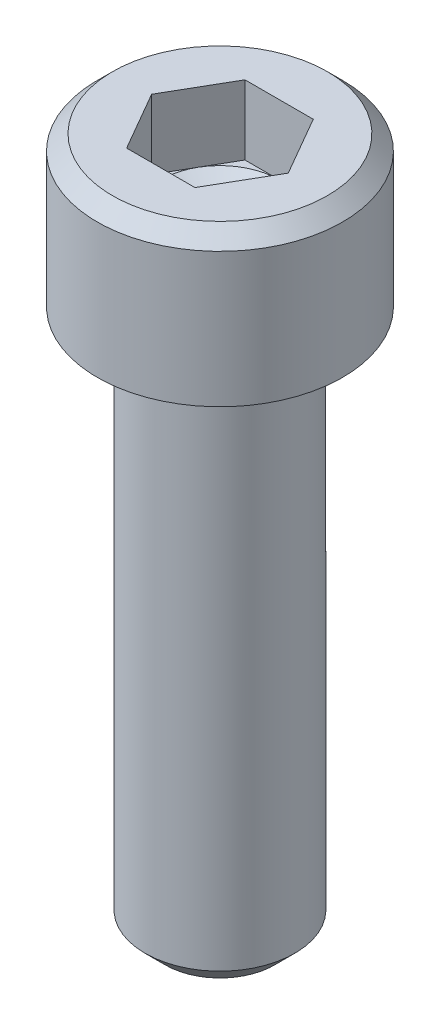
ISO-10303-21;
HEADER;
FILE_DESCRIPTION(('STEP AP214'),'2;1');
FILE_NAME('part.step','',(''),(''),'','','');
FILE_SCHEMA(('AUTOMOTIVE_DESIGN { 1 0 10303 214 1 1 1 1 }'));
ENDSEC;
DATA;
#1=APPLICATION_CONTEXT('core data for automotive mechanical design processes');
#2=APPLICATION_PROTOCOL_DEFINITION('international standard','automotive_design',2000,#1);
#3=PRODUCT_CONTEXT('',#1,'mechanical');
#4=PRODUCT('Part','Part','',(#3));
#5=PRODUCT_RELATED_PRODUCT_CATEGORY('part','',(#4));
#6=PRODUCT_DEFINITION_FORMATION('','',#4);
#7=PRODUCT_DEFINITION_CONTEXT('part definition',#1,'design');
#8=PRODUCT_DEFINITION('design','',#6,#7);
#9=PRODUCT_DEFINITION_SHAPE('','',#8);
#10=(LENGTH_UNIT() NAMED_UNIT(*) SI_UNIT(.MILLI.,.METRE.));
#11=(NAMED_UNIT(*) PLANE_ANGLE_UNIT() SI_UNIT($,.RADIAN.));
#12=(NAMED_UNIT(*) SI_UNIT($,.STERADIAN.) SOLID_ANGLE_UNIT());
#13=UNCERTAINTY_MEASURE_WITH_UNIT(LENGTH_MEASURE(1.E-05),#10,'distance_accuracy_value','');
#14=(GEOMETRIC_REPRESENTATION_CONTEXT(3) GLOBAL_UNCERTAINTY_ASSIGNED_CONTEXT((#13)) GLOBAL_UNIT_ASSIGNED_CONTEXT((#10,
#11,#12)) REPRESENTATION_CONTEXT('',''));
#15=CARTESIAN_POINT('',(0.,0.,0.));
#16=DIRECTION('',(0.,0.,1.));
#17=DIRECTION('',(1.,0.,0.));
#18=AXIS2_PLACEMENT_3D('',#15,#16,#17);
#19=CARTESIAN_POINT('',(0.,1.8796,0.));
#20=DIRECTION('',(0.,1.,0.));
#21=DIRECTION('',(0.,0.,1.));
#22=AXIS2_PLACEMENT_3D('',#19,#20,#21);
#23=PLANE('',#22);
#24=DIRECTION('',(0.5,0.,-0.866025403784439));
#25=VECTOR('',#24,1.);
#26=CARTESIAN_POINT('',(0.799225977639064,1.8796,1.38429999999992));
#27=LINE('',#26,#25);
#28=CARTESIAN_POINT('',(0.799225977639064,1.8796,1.38429999999992));
#29=VERTEX_POINT('',#28);
#30=CARTESIAN_POINT('',(1.19883896645866,1.87960000005181,0.692149999999922));
#31=VERTEX_POINT('',#30);
#32=EDGE_CURVE('E159',#29,#31,#27,.T.);
#33=ORIENTED_EDGE('',*,*,#32,.T.);
#34=CARTESIAN_POINT('',(0.,1.87960000005181,0.));
#35=DIRECTION('',(0.,-1.,0.));
#36=DIRECTION('',(1.,0.,0.));
#37=AXIS2_PLACEMENT_3D('',#34,#35,#36);
#38=CIRCLE('',#37,1.38429999998393);
#39=CARTESIAN_POINT('',(0.,1.87960000005181,1.38429999998393));
#40=VERTEX_POINT('',#39);
#41=EDGE_CURVE('E47',#31,#40,#38,.T.);
#42=ORIENTED_EDGE('',*,*,#41,.T.);
#43=DIRECTION('',(1.,0.,0.));
#44=VECTOR('',#43,1.);
#45=CARTESIAN_POINT('',(-0.799225977639255,1.8796,1.38429999999992));
#46=LINE('',#45,#44);
#47=EDGE_CURVE('E189',#40,#29,#46,.T.);
#48=ORIENTED_EDGE('',*,*,#47,.T.);
#49=EDGE_LOOP('',(#33,#42,#48));
#50=FACE_BOUND('',#49,.T.);
#51=ADVANCED_FACE('F32',(#50),#23,.T.);
#52=CARTESIAN_POINT('',(-0.799225977639255,1.8796,1.38429999999992));
#53=VERTEX_POINT('',#52);
#54=EDGE_CURVE('E279',#53,#40,#46,.T.);
#55=ORIENTED_EDGE('',*,*,#54,.T.);
#56=CARTESIAN_POINT('',(-1.19883896644491,1.87960000005181,0.692149999991913));
#57=VERTEX_POINT('',#56);
#58=EDGE_CURVE('E208',#40,#57,#38,.T.);
#59=ORIENTED_EDGE('',*,*,#58,.T.);
#60=DIRECTION('',(0.499999999999962,0.,0.866025403784461));
#61=VECTOR('',#60,1.);
#62=CARTESIAN_POINT('',(-1.59845195527835,1.8796,0.));
#63=LINE('',#62,#61);
#64=EDGE_CURVE('E168',#57,#53,#63,.T.);
#65=ORIENTED_EDGE('',*,*,#64,.T.);
#66=EDGE_LOOP('',(#55,#59,#65));
#67=FACE_BOUND('',#66,.T.);
#68=ADVANCED_FACE('F122',(#67),#23,.T.);
#69=CARTESIAN_POINT('',(-1.59845195527835,1.8796,0.));
#70=VERTEX_POINT('',#69);
#71=EDGE_CURVE('E169',#70,#57,#63,.T.);
#72=ORIENTED_EDGE('',*,*,#71,.T.);
#73=CARTESIAN_POINT('',(-1.19883896644488,1.87960000005181,-0.692149999991966));
#74=VERTEX_POINT('',#73);
#75=EDGE_CURVE('E282',#57,#74,#38,.T.);
#76=ORIENTED_EDGE('',*,*,#75,.T.);
#77=DIRECTION('',(-0.5,0.,0.866025403784439));
#78=VECTOR('',#77,1.);
#79=CARTESIAN_POINT('',(-0.799225977639255,1.8796,-1.38429999999987));
#80=LINE('',#79,#78);
#81=EDGE_CURVE('E164',#74,#70,#80,.T.);
#82=ORIENTED_EDGE('',*,*,#81,.T.);
#83=EDGE_LOOP('',(#72,#76,#82));
#84=FACE_BOUND('',#83,.T.);
#85=ADVANCED_FACE('F128',(#84),#23,.T.);
#86=CARTESIAN_POINT('',(-0.799225977639255,1.8796,-1.38429999999987));
#87=VERTEX_POINT('',#86);
#88=EDGE_CURVE('E165',#87,#74,#80,.T.);
#89=ORIENTED_EDGE('',*,*,#88,.T.);
#90=CARTESIAN_POINT('',(0.,1.87960000005181,-1.38429999998393));
#91=VERTEX_POINT('',#90);
#92=EDGE_CURVE('E285',#74,#91,#38,.T.);
#93=ORIENTED_EDGE('',*,*,#92,.T.);
#94=DIRECTION('',(-1.,0.,0.));
#95=VECTOR('',#94,1.);
#96=CARTESIAN_POINT('',(0.799225977638982,1.8796,-1.38429999999987));
#97=LINE('',#96,#95);
#98=EDGE_CURVE('E154',#91,#87,#97,.T.);
#99=ORIENTED_EDGE('',*,*,#98,.T.);
#100=EDGE_LOOP('',(#89,#93,#99));
#101=FACE_BOUND('',#100,.T.);
#102=ADVANCED_FACE('F143',(#101),#23,.T.);
#103=CARTESIAN_POINT('',(0.799225977638982,1.8796,-1.38429999999987));
#104=VERTEX_POINT('',#103);
#105=EDGE_CURVE('E157',#104,#91,#97,.T.);
#106=ORIENTED_EDGE('',*,*,#105,.T.);
#107=CARTESIAN_POINT('',(1.19883896644488,1.87960000005181,-0.692149999991966));
#108=VERTEX_POINT('',#107);
#109=EDGE_CURVE('E283',#91,#108,#38,.T.);
#110=ORIENTED_EDGE('',*,*,#109,.T.);
#111=DIRECTION('',(-0.5,0.,-0.866025403784439));
#112=VECTOR('',#111,1.);
#113=CARTESIAN_POINT('',(1.59845195527816,1.8796,0.));
#114=LINE('',#113,#112);
#115=EDGE_CURVE('E155',#108,#104,#114,.T.);
#116=ORIENTED_EDGE('',*,*,#115,.T.);
#117=EDGE_LOOP('',(#106,#110,#116));
#118=FACE_BOUND('',#117,.T.);
#119=ADVANCED_FACE('F134',(#118),#23,.T.);
#120=CARTESIAN_POINT('',(1.59845195527816,1.8796,0.));
#121=VERTEX_POINT('',#120);
#122=EDGE_CURVE('E147',#121,#108,#114,.T.);
#123=ORIENTED_EDGE('',*,*,#122,.T.);
#124=EDGE_CURVE('E148',#108,#31,#38,.T.);
#125=ORIENTED_EDGE('',*,*,#124,.T.);
#126=EDGE_CURVE('E150',#31,#121,#27,.T.);
#127=ORIENTED_EDGE('',*,*,#126,.T.);
#128=EDGE_LOOP('',(#123,#125,#127));
#129=FACE_BOUND('',#128,.T.);
#130=ADVANCED_FACE('F124',(#129),#23,.T.);
#131=CARTESIAN_POINT('',(0.,0.,0.));
#132=DIRECTION('',(0.,-1.,0.));
#133=DIRECTION('',(0.,0.,-1.));
#134=AXIS2_PLACEMENT_3D('',#131,#132,#133);
#135=PLANE('',#134);
#136=CARTESIAN_POINT('',(0.,0.,0.));
#137=DIRECTION('',(0.,-1.,0.));
#138=DIRECTION('',(0.,0.,-1.));
#139=AXIS2_PLACEMENT_3D('',#136,#137,#138);
#140=CIRCLE('',#139,2.0066);
#141=CARTESIAN_POINT('',(0.,0.,-2.0066));
#142=VERTEX_POINT('',#141);
#143=EDGE_CURVE('E11',#142,#142,#140,.F.);
#144=ORIENTED_EDGE('',*,*,#143,.T.);
#145=EDGE_LOOP('',(#144));
#146=FACE_BOUND('',#145,.T.);
#147=CARTESIAN_POINT('',(0.,0.,0.));
#148=DIRECTION('',(0.,-1.,0.));
#149=DIRECTION('',(0.,0.,-1.));
#150=AXIS2_PLACEMENT_3D('',#147,#148,#149);
#151=CIRCLE('',#150,2.8702);
#152=CARTESIAN_POINT('',(0.,0.,-2.8702));
#153=VERTEX_POINT('',#152);
#154=EDGE_CURVE('E192',#153,#153,#151,.T.);
#155=ORIENTED_EDGE('',*,*,#154,.T.);
#156=EDGE_LOOP('',(#155));
#157=FACE_BOUND('',#156,.T.);
#158=ADVANCED_FACE('F133',(#146,#157),#135,.T.);
#159=CARTESIAN_POINT('',(0.,3.5052,0.));
#160=DIRECTION('',(0.,-1.,0.));
#161=DIRECTION('',(0.,0.,-1.));
#162=AXIS2_PLACEMENT_3D('',#159,#160,#161);
#163=CYLINDRICAL_SURFACE('',#162,2.8702);
#164=CARTESIAN_POINT('',(0.,3.14959999996017,0.));
#165=DIRECTION('',(0.,1.,0.));
#166=DIRECTION('',(0.,0.,1.));
#167=AXIS2_PLACEMENT_3D('',#164,#165,#166);
#168=CIRCLE('',#167,2.8702);
#169=CARTESIAN_POINT('',(0.,3.14959999996017,-2.8702));
#170=VERTEX_POINT('',#169);
#171=EDGE_CURVE('E211',#170,#170,#168,.F.);
#172=ORIENTED_EDGE('',*,*,#171,.T.);
#173=EDGE_LOOP('',(#172));
#174=FACE_BOUND('',#173,.T.);
#175=ORIENTED_EDGE('',*,*,#154,.F.);
#176=EDGE_LOOP('',(#175));
#177=FACE_BOUND('',#176,.T.);
#178=ADVANCED_FACE('F140',(#174,#177),#163,.T.);
#179=CARTESIAN_POINT('',(2.8702,3.5052,0.));
#180=DIRECTION('',(0.,1.,0.));
#181=DIRECTION('',(0.,0.,1.));
#182=AXIS2_PLACEMENT_3D('',#179,#180,#181);
#183=PLANE('',#182);
#184=CARTESIAN_POINT('',(0.,3.5052,0.));
#185=DIRECTION('',(0.,1.,0.));
#186=DIRECTION('',(0.,0.,1.));
#187=AXIS2_PLACEMENT_3D('',#184,#185,#186);
#188=CIRCLE('',#187,2.51459999996016);
#189=CARTESIAN_POINT('',(0.,3.5052,-2.51459999996016));
#190=VERTEX_POINT('',#189);
#191=EDGE_CURVE('E214',#190,#190,#188,.T.);
#192=ORIENTED_EDGE('',*,*,#191,.T.);
#193=EDGE_LOOP('',(#192));
#194=FACE_BOUND('',#193,.T.);
#195=DIRECTION('',(1.,0.,0.));
#196=VECTOR('',#195,1.);
#197=CARTESIAN_POINT('',(-0.799225977639255,3.5052,1.38429999999992));
#198=LINE('',#197,#196);
#199=CARTESIAN_POINT('',(-0.799225977639255,3.5052,1.38429999999992));
#200=VERTEX_POINT('',#199);
#201=CARTESIAN_POINT('',(0.799225977639064,3.5052,1.38429999999992));
#202=VERTEX_POINT('',#201);
#203=EDGE_CURVE('E55',#200,#202,#198,.T.);
#204=ORIENTED_EDGE('',*,*,#203,.F.);
#205=DIRECTION('',(0.499999999999962,0.,0.866025403784461));
#206=VECTOR('',#205,1.);
#207=CARTESIAN_POINT('',(-1.59845195527835,3.5052,0.));
#208=LINE('',#207,#206);
#209=CARTESIAN_POINT('',(-1.59845195527835,3.5052,0.));
#210=VERTEX_POINT('',#209);
#211=EDGE_CURVE('E186',#210,#200,#208,.T.);
#212=ORIENTED_EDGE('',*,*,#211,.F.);
#213=DIRECTION('',(-0.5,0.,0.866025403784439));
#214=VECTOR('',#213,1.);
#215=CARTESIAN_POINT('',(-0.799225977639255,3.5052,-1.38429999999987));
#216=LINE('',#215,#214);
#217=CARTESIAN_POINT('',(-0.799225977639255,3.5052,-1.38429999999987));
#218=VERTEX_POINT('',#217);
#219=EDGE_CURVE('E183',#218,#210,#216,.T.);
#220=ORIENTED_EDGE('',*,*,#219,.F.);
#221=DIRECTION('',(-1.,0.,0.));
#222=VECTOR('',#221,1.);
#223=CARTESIAN_POINT('',(0.799225977638982,3.5052,-1.38429999999987));
#224=LINE('',#223,#222);
#225=CARTESIAN_POINT('',(0.799225977638982,3.5052,-1.38429999999987));
#226=VERTEX_POINT('',#225);
#227=EDGE_CURVE('E180',#226,#218,#224,.T.);
#228=ORIENTED_EDGE('',*,*,#227,.F.);
#229=DIRECTION('',(-0.5,0.,-0.866025403784439));
#230=VECTOR('',#229,1.);
#231=CARTESIAN_POINT('',(1.59845195527816,3.5052,0.));
#232=LINE('',#231,#230);
#233=CARTESIAN_POINT('',(1.59845195527816,3.5052,0.));
#234=VERTEX_POINT('',#233);
#235=EDGE_CURVE('E177',#234,#226,#232,.T.);
#236=ORIENTED_EDGE('',*,*,#235,.F.);
#237=DIRECTION('',(0.5,0.,-0.866025403784439));
#238=VECTOR('',#237,1.);
#239=CARTESIAN_POINT('',(0.799225977639064,3.5052,1.38429999999992));
#240=LINE('',#239,#238);
#241=EDGE_CURVE('E174',#202,#234,#240,.T.);
#242=ORIENTED_EDGE('',*,*,#241,.F.);
#243=EDGE_LOOP('',(#204,#212,#220,#228,#236,#242));
#244=FACE_BOUND('',#243,.T.);
#245=ADVANCED_FACE('F233',(#194,#244),#183,.T.);
#246=CARTESIAN_POINT('',(0.,-12.7,0.));
#247=DIRECTION('',(0.,1.,0.));
#248=DIRECTION('',(0.,0.,1.));
#249=AXIS2_PLACEMENT_3D('',#246,#247,#248);
#250=CYLINDRICAL_SURFACE('',#249,1.7526);
#251=CARTESIAN_POINT('',(0.,-0.254000000000001,0.));
#252=DIRECTION('',(0.,-1.,0.));
#253=DIRECTION('',(0.,0.,-1.));
#254=AXIS2_PLACEMENT_3D('',#251,#252,#253);
#255=CIRCLE('',#254,1.7526);
#256=CARTESIAN_POINT('',(0.,-0.254000000000001,-1.7526));
#257=VERTEX_POINT('',#256);
#258=EDGE_CURVE('E40',#257,#257,#255,.T.);
#259=ORIENTED_EDGE('',*,*,#258,.T.);
#260=EDGE_LOOP('',(#259));
#261=FACE_BOUND('',#260,.T.);
#262=CARTESIAN_POINT('',(0.,-12.2275599999848,0.));
#263=DIRECTION('',(0.,-1.,0.));
#264=DIRECTION('',(0.,0.,-1.));
#265=AXIS2_PLACEMENT_3D('',#262,#263,#264);
#266=CIRCLE('',#265,1.7526);
#267=CARTESIAN_POINT('',(0.,-12.2275599999848,1.7526));
#268=VERTEX_POINT('',#267);
#269=EDGE_CURVE('E207',#268,#268,#266,.F.);
#270=ORIENTED_EDGE('',*,*,#269,.T.);
#271=EDGE_LOOP('',(#270));
#272=FACE_BOUND('',#271,.T.);
#273=ADVANCED_FACE('F219',(#261,#272),#250,.T.);
#274=CARTESIAN_POINT('',(0.,-12.7,0.));
#275=DIRECTION('',(0.,-1.,0.));
#276=DIRECTION('',(0.,0.,-1.));
#277=AXIS2_PLACEMENT_3D('',#274,#275,#276);
#278=PLANE('',#277);
#279=CARTESIAN_POINT('',(0.,-12.7,0.));
#280=DIRECTION('',(0.,-1.,0.));
#281=DIRECTION('',(0.,0.,-1.));
#282=AXIS2_PLACEMENT_3D('',#279,#280,#281);
#283=CIRCLE('',#282,1.28015999998476);
#284=CARTESIAN_POINT('',(0.,-12.7,1.28015999998476));
#285=VERTEX_POINT('',#284);
#286=EDGE_CURVE('E204',#285,#285,#283,.T.);
#287=ORIENTED_EDGE('',*,*,#286,.T.);
#288=EDGE_LOOP('',(#287));
#289=FACE_BOUND('',#288,.T.);
#290=ADVANCED_FACE('F244',(#289),#278,.T.);
#291=CARTESIAN_POINT('',(-0.799225977639255,1.8796,1.38429999999992));
#292=DIRECTION('',(0.,0.,1.));
#293=DIRECTION('',(1.,0.,0.));
#294=AXIS2_PLACEMENT_3D('',#291,#292,#293);
#295=PLANE('',#294);
#296=ORIENTED_EDGE('',*,*,#203,.T.);
#297=DIRECTION('',(0.,1.,0.));
#298=VECTOR('',#297,1.);
#299=CARTESIAN_POINT('',(0.799225977639064,1.8796,1.38429999999992));
#300=LINE('',#299,#298);
#301=EDGE_CURVE('E172',#29,#202,#300,.T.);
#302=ORIENTED_EDGE('',*,*,#301,.F.);
#303=ORIENTED_EDGE('',*,*,#47,.F.);
#304=ORIENTED_EDGE('',*,*,#54,.F.);
#305=DIRECTION('',(0.,1.,0.));
#306=VECTOR('',#305,1.);
#307=CARTESIAN_POINT('',(-0.799225977639255,1.8796,1.38429999999992));
#308=LINE('',#307,#306);
#309=EDGE_CURVE('E190',#53,#200,#308,.T.);
#310=ORIENTED_EDGE('',*,*,#309,.T.);
#311=EDGE_LOOP('',(#296,#302,#303,#304,#310));
#312=FACE_BOUND('',#311,.T.);
#313=ADVANCED_FACE('F247',(#312),#295,.F.);
#314=CARTESIAN_POINT('',(-1.59845195527835,1.8796,0.));
#315=DIRECTION('',(-0.866025403784461,0.,0.499999999999962));
#316=DIRECTION('',(0.499999999999962,0.,0.866025403784461));
#317=AXIS2_PLACEMENT_3D('',#314,#315,#316);
#318=PLANE('',#317);
#319=ORIENTED_EDGE('',*,*,#211,.T.);
#320=ORIENTED_EDGE('',*,*,#309,.F.);
#321=ORIENTED_EDGE('',*,*,#64,.F.);
#322=ORIENTED_EDGE('',*,*,#71,.F.);
#323=DIRECTION('',(0.,1.,0.));
#324=VECTOR('',#323,1.);
#325=CARTESIAN_POINT('',(-1.59845195527835,1.8796,0.));
#326=LINE('',#325,#324);
#327=EDGE_CURVE('E193',#70,#210,#326,.T.);
#328=ORIENTED_EDGE('',*,*,#327,.T.);
#329=EDGE_LOOP('',(#319,#320,#321,#322,#328));
#330=FACE_BOUND('',#329,.T.);
#331=ADVANCED_FACE('F250',(#330),#318,.F.);
#332=CARTESIAN_POINT('',(-0.799225977639255,1.8796,-1.38429999999987));
#333=DIRECTION('',(-0.866025403784439,0.,-0.5));
#334=DIRECTION('',(-0.5,0.,0.866025403784439));
#335=AXIS2_PLACEMENT_3D('',#332,#333,#334);
#336=PLANE('',#335);
#337=ORIENTED_EDGE('',*,*,#219,.T.);
#338=ORIENTED_EDGE('',*,*,#327,.F.);
#339=ORIENTED_EDGE('',*,*,#81,.F.);
#340=ORIENTED_EDGE('',*,*,#88,.F.);
#341=DIRECTION('',(0.,1.,0.));
#342=VECTOR('',#341,1.);
#343=CARTESIAN_POINT('',(-0.799225977639255,1.8796,-1.38429999999987));
#344=LINE('',#343,#342);
#345=EDGE_CURVE('E195',#87,#218,#344,.T.);
#346=ORIENTED_EDGE('',*,*,#345,.T.);
#347=EDGE_LOOP('',(#337,#338,#339,#340,#346));
#348=FACE_BOUND('',#347,.T.);
#349=ADVANCED_FACE('F257',(#348),#336,.F.);
#350=CARTESIAN_POINT('',(0.799225977638982,1.8796,-1.38429999999987));
#351=DIRECTION('',(0.,0.,-1.));
#352=DIRECTION('',(-1.,0.,0.));
#353=AXIS2_PLACEMENT_3D('',#350,#351,#352);
#354=PLANE('',#353);
#355=ORIENTED_EDGE('',*,*,#227,.T.);
#356=ORIENTED_EDGE('',*,*,#345,.F.);
#357=ORIENTED_EDGE('',*,*,#98,.F.);
#358=ORIENTED_EDGE('',*,*,#105,.F.);
#359=DIRECTION('',(0.,1.,0.));
#360=VECTOR('',#359,1.);
#361=CARTESIAN_POINT('',(0.799225977638982,1.8796,-1.38429999999987));
#362=LINE('',#361,#360);
#363=EDGE_CURVE('E197',#104,#226,#362,.T.);
#364=ORIENTED_EDGE('',*,*,#363,.T.);
#365=EDGE_LOOP('',(#355,#356,#357,#358,#364));
#366=FACE_BOUND('',#365,.T.);
#367=ADVANCED_FACE('F254',(#366),#354,.F.);
#368=CARTESIAN_POINT('',(1.59845195527816,1.8796,0.));
#369=DIRECTION('',(0.866025403784439,0.,-0.5));
#370=DIRECTION('',(-0.5,0.,-0.866025403784439));
#371=AXIS2_PLACEMENT_3D('',#368,#369,#370);
#372=PLANE('',#371);
#373=ORIENTED_EDGE('',*,*,#235,.T.);
#374=ORIENTED_EDGE('',*,*,#363,.F.);
#375=ORIENTED_EDGE('',*,*,#115,.F.);
#376=ORIENTED_EDGE('',*,*,#122,.F.);
#377=DIRECTION('',(0.,1.,0.));
#378=VECTOR('',#377,1.);
#379=CARTESIAN_POINT('',(1.59845195527816,1.8796,0.));
#380=LINE('',#379,#378);
#381=EDGE_CURVE('E199',#121,#234,#380,.T.);
#382=ORIENTED_EDGE('',*,*,#381,.T.);
#383=EDGE_LOOP('',(#373,#374,#375,#376,#382));
#384=FACE_BOUND('',#383,.T.);
#385=ADVANCED_FACE('F117',(#384),#372,.F.);
#386=CARTESIAN_POINT('',(0.799225977639064,1.8796,1.38429999999992));
#387=DIRECTION('',(0.866025403784439,0.,0.5));
#388=DIRECTION('',(0.5,0.,-0.866025403784439));
#389=AXIS2_PLACEMENT_3D('',#386,#387,#388);
#390=PLANE('',#389);
#391=ORIENTED_EDGE('',*,*,#241,.T.);
#392=ORIENTED_EDGE('',*,*,#381,.F.);
#393=ORIENTED_EDGE('',*,*,#126,.F.);
#394=ORIENTED_EDGE('',*,*,#32,.F.);
#395=ORIENTED_EDGE('',*,*,#301,.T.);
#396=EDGE_LOOP('',(#391,#392,#393,#394,#395));
#397=FACE_BOUND('',#396,.T.);
#398=ADVANCED_FACE('F108',(#397),#390,.F.);
#399=CARTESIAN_POINT('',(0.,1.08037402242189,0.));
#400=DIRECTION('',(0.,1.,0.));
#401=DIRECTION('',(-1.,0.,0.));
#402=AXIS2_PLACEMENT_3D('',#399,#400,#401);
#403=CONICAL_SURFACE('',#402,0.,1.0471975511966);
#404=ORIENTED_EDGE('',*,*,#41,.F.);
#405=ORIENTED_EDGE('',*,*,#124,.F.);
#406=ORIENTED_EDGE('',*,*,#109,.F.);
#407=ORIENTED_EDGE('',*,*,#92,.F.);
#408=ORIENTED_EDGE('',*,*,#75,.F.);
#409=ORIENTED_EDGE('',*,*,#58,.F.);
#410=EDGE_LOOP('',(#404,#405,#406,#407,#408,#409));
#411=FACE_BOUND('',#410,.T.);
#412=CARTESIAN_POINT('',(0.,1.08037402242189,0.));
#413=VERTEX_POINT('',#412);
#414=VERTEX_LOOP('',#413);
#415=FACE_BOUND('',#414,.T.);
#416=ADVANCED_FACE('F105',(#411,#415),#403,.F.);
#417=CARTESIAN_POINT('',(0.,-12.7,0.));
#418=DIRECTION('',(0.,1.,0.));
#419=DIRECTION('',(0.,0.,1.));
#420=AXIS2_PLACEMENT_3D('',#417,#418,#419);
#421=CONICAL_SURFACE('',#420,1.28015999998476,0.785398163397447);
#422=CARTESIAN_POINT('',(0.,-12.2275599999848,1.7526));
#423=CARTESIAN_POINT('',(0.,-12.2324812499849,1.74767874999984));
#424=CARTESIAN_POINT('',(0.,-12.2374024999851,1.74275749999968));
#425=CARTESIAN_POINT('',(0.,-12.2472449999854,1.73291499999937));
#426=CARTESIAN_POINT('',(0.,-12.2521662499855,1.72799374999921));
#427=CARTESIAN_POINT('',(0.,-12.2620087499859,1.71815124999889));
#428=CARTESIAN_POINT('',(0.,-12.266929999986,1.71322999999873));
#429=CARTESIAN_POINT('',(0.,-12.2767724999863,1.70338749999841));
#430=CARTESIAN_POINT('',(0.,-12.2816937499865,1.69846624999825));
#431=CARTESIAN_POINT('',(0.,-12.2915362499868,1.68862374999794));
#432=CARTESIAN_POINT('',(0.,-12.296457499987,1.68370249999778));
#433=CARTESIAN_POINT('',(0.,-12.3062999999873,1.67385999999746));
#434=CARTESIAN_POINT('',(0.,-12.3112212499875,1.6689387499973));
#435=CARTESIAN_POINT('',(0.,-12.3210637499878,1.65909624999698));
#436=CARTESIAN_POINT('',(0.,-12.3259849999879,1.65417499999683));
#437=CARTESIAN_POINT('',(0.,-12.3358274999882,1.64433249999651));
#438=CARTESIAN_POINT('',(0.,-12.3407487499884,1.63941124999635));
#439=CARTESIAN_POINT('',(0.,-12.3505912499887,1.62956874999603));
#440=CARTESIAN_POINT('',(0.,-12.3555124999889,1.62464749999587));
#441=CARTESIAN_POINT('',(0.,-12.3653549999892,1.61480499999555));
#442=CARTESIAN_POINT('',(0.,-12.3702762499894,1.6098837499954));
#443=CARTESIAN_POINT('',(0.,-12.3801187499897,1.60004124999508));
#444=CARTESIAN_POINT('',(0.,-12.3850399999898,1.59511999999492));
#445=CARTESIAN_POINT('',(0.,-12.3948824999902,1.5852774999946));
#446=CARTESIAN_POINT('',(0.,-12.3998037499903,1.58035624999444));
#447=CARTESIAN_POINT('',(0.,-12.4096462499906,1.57051374999413));
#448=CARTESIAN_POINT('',(0.,-12.4145674999908,1.56559249999397));
#449=CARTESIAN_POINT('',(0.,-12.4244099999911,1.55574999999365));
#450=CARTESIAN_POINT('',(0.,-12.4293312499913,1.55082874999349));
#451=CARTESIAN_POINT('',(0.,-12.4391737499916,1.54098624999317));
#452=CARTESIAN_POINT('',(0.,-12.4440949999917,1.53606499999301));
#453=CARTESIAN_POINT('',(0.,-12.4539374999921,1.5262224999927));
#454=CARTESIAN_POINT('',(0.,-12.4588587499922,1.52130124999254));
#455=CARTESIAN_POINT('',(0.,-12.4687012499925,1.51145874999222));
#456=CARTESIAN_POINT('',(0.,-12.4736224999927,1.50653749999206));
#457=CARTESIAN_POINT('',(0.,-12.483464999993,1.49669499999174));
#458=CARTESIAN_POINT('',(0.,-12.4883862499932,1.49177374999158));
#459=CARTESIAN_POINT('',(0.,-12.4982287499935,1.48193124999127));
#460=CARTESIAN_POINT('',(0.,-12.5031499999936,1.47700999999111));
#461=CARTESIAN_POINT('',(0.,-12.512992499994,1.46716749999079));
#462=CARTESIAN_POINT('',(0.,-12.5179137499941,1.46224624999063));
#463=CARTESIAN_POINT('',(0.,-12.5277562499944,1.45240374999031));
#464=CARTESIAN_POINT('',(0.,-12.5326774999946,1.44748249999016));
#465=CARTESIAN_POINT('',(0.,-12.5425199999949,1.43763999998984));
#466=CARTESIAN_POINT('',(0.,-12.5474412499951,1.43271874998968));
#467=CARTESIAN_POINT('',(0.,-12.5572837499954,1.42287624998936));
#468=CARTESIAN_POINT('',(0.,-12.5622049999956,1.4179549999892));
#469=CARTESIAN_POINT('',(0.,-12.5720474999959,1.40811249998889));
#470=CARTESIAN_POINT('',(0.,-12.576968749996,1.40319124998873));
#471=CARTESIAN_POINT('',(0.,-12.5868112499963,1.39334874998841));
#472=CARTESIAN_POINT('',(0.,-12.5917324999965,1.38842749998825));
#473=CARTESIAN_POINT('',(0.,-12.6015749999968,1.37858499998793));
#474=CARTESIAN_POINT('',(0.,-12.606496249997,1.37366374998777));
#475=CARTESIAN_POINT('',(0.,-12.6163387499973,1.36382124998746));
#476=CARTESIAN_POINT('',(0.,-12.6212599999975,1.3588999999873));
#477=CARTESIAN_POINT('',(0.,-12.6311024999978,1.34905749998698));
#478=CARTESIAN_POINT('',(0.,-12.6360237499979,1.34413624998682));
#479=CARTESIAN_POINT('',(0.,-12.6458662499983,1.3342937499865));
#480=CARTESIAN_POINT('',(0.,-12.6507874999984,1.32937249998634));
#481=CARTESIAN_POINT('',(0.,-12.6606299999987,1.31952999998603));
#482=CARTESIAN_POINT('',(0.,-12.6655512499989,1.31460874998587));
#483=CARTESIAN_POINT('',(0.,-12.6753937499992,1.30476624998555));
#484=CARTESIAN_POINT('',(0.,-12.6803149999994,1.29984499998539));
#485=CARTESIAN_POINT('',(0.,-12.6901574999997,1.29000249998507));
#486=CARTESIAN_POINT('',(0.,-12.6950787499998,1.28508124998492));
#487=CARTESIAN_POINT('',(0.,-12.7,1.28015999998476));
#488=B_SPLINE_CURVE_WITH_KNOTS('',3,(#422,#423,#424,#425,#426,#427,#428,#429,#430,#431,#432,
#433,#434,#435,#436,#437,#438,#439,#440,#441,#442,#443,#444,#445,#446,#447,#448,#449,#450,#451,
#452,#453,#454,#455,#456,#457,#458,#459,#460,#461,#462,#463,#464,#465,#466,#467,#468,#469,#470,
#471,#472,#473,#474,#475,#476,#477,#478,#479,#480,#481,#482,#483,#484,#485,#486,#487),
.UNSPECIFIED.,.F.,.F.,(4,2,2,2,2,2,2,2,2,2,2,2,2,2,2,2,2,2,2,2,2,2,2,2,2,2,2,2,2,2,2,2,4),(0.,
0.0208790954821603,0.0417581909643194,0.0626372864464785,0.0835163819286388,0.104395477410798,
0.125274572892957,0.146153668375118,0.167032763857277,0.187911859339436,0.208790954821596,
0.229670050303755,0.250549145785915,0.271428241268075,0.292307336750234,0.313186432232393,
0.334065527714552,0.354944623196713,0.375823718678872,0.396702814161031,0.417581909643191,
0.43846100512535,0.459340100607509,0.48021919608967,0.501098291571829,0.521977387053988,
0.542856482536148,0.563735578018308,0.584614673500467,0.605493768982627,0.626372864464786,
0.647251959946945,0.668131055429106),.UNSPECIFIED.);
#489=EDGE_CURVE('BSEAM107',#268,#285,#488,.T.);
#490=ORIENTED_EDGE('',*,*,#269,.F.);
#491=ORIENTED_EDGE('',*,*,#286,.F.);
#492=ORIENTED_EDGE('',*,*,#489,.T.);
#493=ORIENTED_EDGE('',*,*,#489,.F.);
#494=EDGE_LOOP('',(#490,#492,#491,#493));
#495=FACE_BOUND('',#494,.T.);
#496=ADVANCED_FACE('F107',(#495),#421,.T.);
#497=CARTESIAN_POINT('',(0.,3.14959999996017,0.));
#498=DIRECTION('',(0.,-1.,0.));
#499=DIRECTION('',(0.,0.,-1.));
#500=AXIS2_PLACEMENT_3D('',#497,#498,#499);
#501=CONICAL_SURFACE('',#500,2.8702,0.785398163397451);
#502=CARTESIAN_POINT('',(0.,3.5052,-2.51459999996016));
#503=CARTESIAN_POINT('',(0.,3.50149583333292,-2.51830416662725));
#504=CARTESIAN_POINT('',(0.,3.49779166666584,-2.52200833329433));
#505=CARTESIAN_POINT('',(0.,3.49038333333167,-2.52941666662849));
#506=CARTESIAN_POINT('',(0.,3.48667916666459,-2.53312083329557));
#507=CARTESIAN_POINT('',(0.,3.47927083333043,-2.54052916662974));
#508=CARTESIAN_POINT('',(0.,3.47556666666335,-2.54423333329682));
#509=CARTESIAN_POINT('',(0.,3.46815833332918,-2.55164166663098));
#510=CARTESIAN_POINT('',(0.,3.4644541666621,-2.55534583329806));
#511=CARTESIAN_POINT('',(0.,3.45704583332794,-2.56275416663223));
#512=CARTESIAN_POINT('',(0.,3.45334166666086,-2.56645833329931));
#513=CARTESIAN_POINT('',(0.,3.44593333332669,-2.57386666663347));
#514=CARTESIAN_POINT('',(0.,3.44222916665961,-2.57757083330055));
#515=CARTESIAN_POINT('',(0.,3.43482083332545,-2.58497916663472));
#516=CARTESIAN_POINT('',(0.,3.43111666665837,-2.5886833333018));
#517=CARTESIAN_POINT('',(0.,3.4237083333242,-2.59609166663596));
#518=CARTESIAN_POINT('',(0.,3.42000416665712,-2.59979583330304));
#519=CARTESIAN_POINT('',(0.,3.41259583332296,-2.60720416663721));
#520=CARTESIAN_POINT('',(0.,3.40889166665588,-2.61090833330429));
#521=CARTESIAN_POINT('',(0.,3.40148333332171,-2.61831666663845));
#522=CARTESIAN_POINT('',(0.,3.39777916665463,-2.62202083330553));
#523=CARTESIAN_POINT('',(0.,3.39037083332047,-2.62942916663969));
#524=CARTESIAN_POINT('',(0.,3.38666666665339,-2.63313333330678));
#525=CARTESIAN_POINT('',(0.,3.37925833331923,-2.64054166664094));
#526=CARTESIAN_POINT('',(0.,3.37555416665214,-2.64424583330802));
#527=CARTESIAN_POINT('',(0.,3.36814583331798,-2.65165416664218));
#528=CARTESIAN_POINT('',(0.,3.3644416666509,-2.65535833330927));
#529=CARTESIAN_POINT('',(0.,3.35703333331674,-2.66276666664343));
#530=CARTESIAN_POINT('',(0.,3.35332916664965,-2.66647083331051));
#531=CARTESIAN_POINT('',(0.,3.34592083331549,-2.67387916664467));
#532=CARTESIAN_POINT('',(0.,3.34221666664841,-2.67758333331176));
#533=CARTESIAN_POINT('',(0.,3.33480833331425,-2.68499166664592));
#534=CARTESIAN_POINT('',(0.,3.33110416664716,-2.688695833313));
#535=CARTESIAN_POINT('',(0.,3.323695833313,-2.69610416664716));
#536=CARTESIAN_POINT('',(0.,3.31999166664592,-2.69980833331425));
#537=CARTESIAN_POINT('',(0.,3.31258333331176,-2.70721666664841));
#538=CARTESIAN_POINT('',(0.,3.30887916664467,-2.71092083331549));
#539=CARTESIAN_POINT('',(0.,3.30147083331051,-2.71832916664965));
#540=CARTESIAN_POINT('',(0.,3.29776666664343,-2.72203333331674));
#541=CARTESIAN_POINT('',(0.,3.29035833330927,-2.7294416666509));
#542=CARTESIAN_POINT('',(0.,3.28665416664219,-2.73314583331798));
#543=CARTESIAN_POINT('',(0.,3.27924583330802,-2.74055416665214));
#544=CARTESIAN_POINT('',(0.,3.27554166664094,-2.74425833331923));
#545=CARTESIAN_POINT('',(0.,3.26813333330678,-2.75166666665339));
#546=CARTESIAN_POINT('',(0.,3.2644291666397,-2.75537083332047));
#547=CARTESIAN_POINT('',(0.,3.25702083330553,-2.76277916665463));
#548=CARTESIAN_POINT('',(0.,3.25331666663845,-2.76648333332172));
#549=CARTESIAN_POINT('',(0.,3.24590833330429,-2.77389166665588));
#550=CARTESIAN_POINT('',(0.,3.24220416663721,-2.77759583332296));
#551=CARTESIAN_POINT('',(0.,3.23479583330304,-2.78500416665712));
#552=CARTESIAN_POINT('',(0.,3.23109166663596,-2.7887083333242));
#553=CARTESIAN_POINT('',(0.,3.2236833333018,-2.79611666665837));
#554=CARTESIAN_POINT('',(0.,3.21997916663472,-2.79982083332545));
#555=CARTESIAN_POINT('',(0.,3.21257083330055,-2.80722916665961));
#556=CARTESIAN_POINT('',(0.,3.20886666663347,-2.81093333332669));
#557=CARTESIAN_POINT('',(0.,3.20145833329931,-2.81834166666086));
#558=CARTESIAN_POINT('',(0.,3.19775416663223,-2.82204583332794));
#559=CARTESIAN_POINT('',(0.,3.19034583329806,-2.8294541666621));
#560=CARTESIAN_POINT('',(0.,3.18664166663098,-2.83315833332918));
#561=CARTESIAN_POINT('',(0.,3.17923333329682,-2.84056666666335));
#562=CARTESIAN_POINT('',(0.,3.17552916662974,-2.84427083333043));
#563=CARTESIAN_POINT('',(0.,3.16812083329557,-2.85167916666459));
#564=CARTESIAN_POINT('',(0.,3.16441666662849,-2.85538333333167));
#565=CARTESIAN_POINT('',(0.,3.15700833329433,-2.86279166666584));
#566=CARTESIAN_POINT('',(0.,3.15330416662725,-2.86649583333292));
#567=CARTESIAN_POINT('',(0.,3.14959999996017,-2.8702));
#568=B_SPLINE_CURVE_WITH_KNOTS('',3,(#502,#503,#504,#505,#506,#507,#508,#509,#510,#511,#512,
#513,#514,#515,#516,#517,#518,#519,#520,#521,#522,#523,#524,#525,#526,#527,#528,#529,#530,#531,
#532,#533,#534,#535,#536,#537,#538,#539,#540,#541,#542,#543,#544,#545,#546,#547,#548,#549,#550,
#551,#552,#553,#554,#555,#556,#557,#558,#559,#560,#561,#562,#563,#564,#565,#566,#567),
.UNSPECIFIED.,.F.,.F.,(4,2,2,2,2,2,2,2,2,2,2,2,2,2,2,2,2,2,2,2,2,2,2,2,2,2,2,2,2,2,2,2,4),(0.,
0.0157154482136314,0.0314308964272632,0.0471463446408946,0.0628617928545261,0.0785772410681575,
0.0942926892817889,0.11000813749542,0.125723585709052,0.141439033922683,0.157154482136315,
0.172869930349946,0.188585378563578,0.204300826777209,0.220016274990841,0.235731723204472,
0.251447171418104,0.267162619631736,0.282878067845367,0.298593516058999,0.31430896427263,
0.330024412486261,0.345739860699893,0.361455308913525,0.377170757127156,0.392886205340787,
0.408601653554419,0.42431710176805,0.440032549981682,0.455747998195313,0.471463446408945,
0.487178894622576,0.502894342836208),.UNSPECIFIED.);
#569=EDGE_CURVE('BSEAM114',#190,#170,#568,.T.);
#570=ORIENTED_EDGE('',*,*,#191,.F.);
#571=ORIENTED_EDGE('',*,*,#171,.F.);
#572=ORIENTED_EDGE('',*,*,#569,.T.);
#573=ORIENTED_EDGE('',*,*,#569,.F.);
#574=EDGE_LOOP('',(#570,#572,#571,#573));
#575=FACE_BOUND('',#574,.T.);
#576=ADVANCED_FACE('F114',(#575),#501,.T.);
#577=CARTESIAN_POINT('',(0.,-0.254000000000001,0.));
#578=DIRECTION('',(0.,-1.,0.));
#579=DIRECTION('',(0.,0.,-1.));
#580=AXIS2_PLACEMENT_3D('',#577,#578,#579);
#581=TOROIDAL_SURFACE('',#580,2.0066,0.254);
#582=ORIENTED_EDGE('',*,*,#143,.F.);
#583=EDGE_LOOP('',(#582));
#584=FACE_BOUND('',#583,.T.);
#585=ORIENTED_EDGE('',*,*,#258,.F.);
#586=EDGE_LOOP('',(#585));
#587=FACE_BOUND('',#586,.T.);
#588=ADVANCED_FACE('F34',(#584,#587),#581,.F.);
#589=CLOSED_SHELL('',(#51,#68,#85,#102,#119,#130,#158,#178,#245,#273,#290,#313,#331,#349,#367,
#385,#398,#416,#496,#576,#588));
#590=MANIFOLD_SOLID_BREP('B2',#589);
#591=ADVANCED_BREP_SHAPE_REPRESENTATION('',(#18,#590),#14);
#592=SHAPE_DEFINITION_REPRESENTATION(#9,#591);
ENDSEC;
END-ISO-10303-21;
